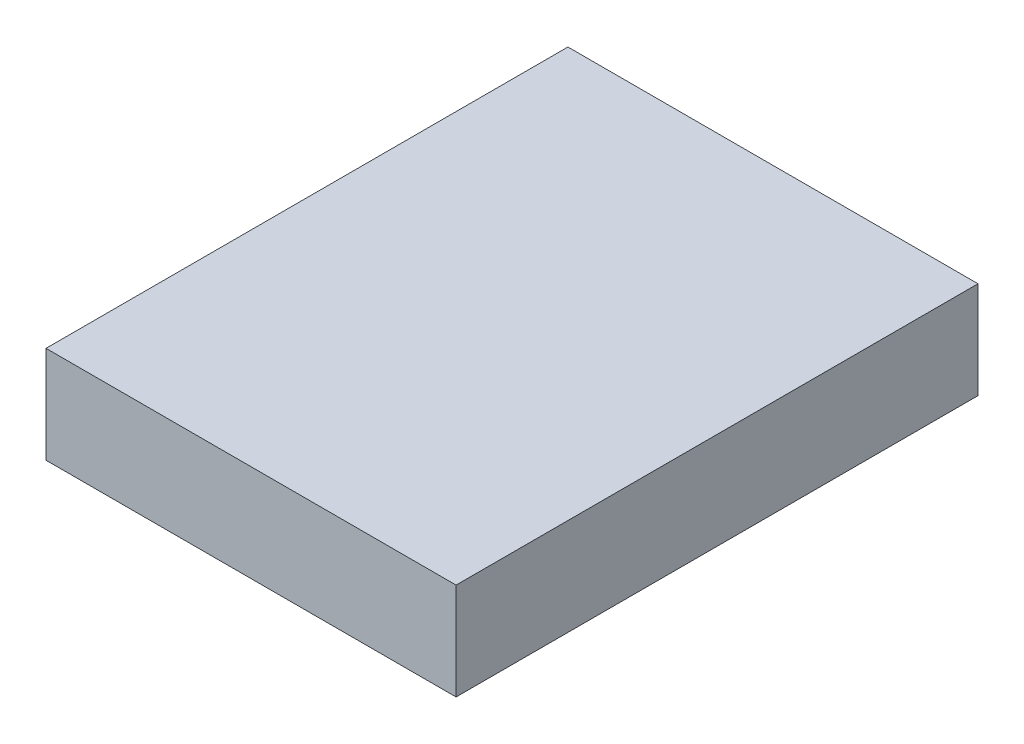
ISO-10303-21;
HEADER;
FILE_DESCRIPTION(('STEP AP214'),'2;1');
FILE_NAME('part.step','',(''),(''),'','','');
FILE_SCHEMA(('AUTOMOTIVE_DESIGN { 1 0 10303 214 1 1 1 1 }'));
ENDSEC;
DATA;
#1=APPLICATION_CONTEXT('core data for automotive mechanical design processes');
#2=APPLICATION_PROTOCOL_DEFINITION('international standard','automotive_design',2000,#1);
#3=PRODUCT_CONTEXT('',#1,'mechanical');
#4=PRODUCT('Part','Part','',(#3));
#5=PRODUCT_RELATED_PRODUCT_CATEGORY('part','',(#4));
#6=PRODUCT_DEFINITION_FORMATION('','',#4);
#7=PRODUCT_DEFINITION_CONTEXT('part definition',#1,'design');
#8=PRODUCT_DEFINITION('design','',#6,#7);
#9=PRODUCT_DEFINITION_SHAPE('','',#8);
#10=(LENGTH_UNIT() NAMED_UNIT(*) SI_UNIT(.MILLI.,.METRE.));
#11=(NAMED_UNIT(*) PLANE_ANGLE_UNIT() SI_UNIT($,.RADIAN.));
#12=(NAMED_UNIT(*) SI_UNIT($,.STERADIAN.) SOLID_ANGLE_UNIT());
#13=UNCERTAINTY_MEASURE_WITH_UNIT(LENGTH_MEASURE(1.E-05),#10,'distance_accuracy_value','');
#14=(GEOMETRIC_REPRESENTATION_CONTEXT(3) GLOBAL_UNCERTAINTY_ASSIGNED_CONTEXT((#13)) GLOBAL_UNIT_ASSIGNED_CONTEXT((#10,
#11,#12)) REPRESENTATION_CONTEXT('',''));
#15=CARTESIAN_POINT('',(0.,0.,0.));
#16=DIRECTION('',(0.,0.,1.));
#17=DIRECTION('',(1.,0.,0.));
#18=AXIS2_PLACEMENT_3D('',#15,#16,#17);
#19=CARTESIAN_POINT('',(29.9874878540281,13.,-33.9718393870808));
#20=DIRECTION('',(-1.,0.,0.));
#21=DIRECTION('',(0.,0.,1.));
#22=AXIS2_PLACEMENT_3D('',#19,#20,#21);
#23=PLANE('',#22);
#24=DIRECTION('',(0.,0.,-1.));
#25=VECTOR('',#24,1.);
#26=CARTESIAN_POINT('',(29.9874878540281,0.,-33.9718393870808));
#27=LINE('',#26,#25);
#28=CARTESIAN_POINT('',(29.9874878540281,0.,36.0281606129192));
#29=VERTEX_POINT('',#28);
#30=CARTESIAN_POINT('',(29.9874878540281,0.,-33.9718393870808));
#31=VERTEX_POINT('',#30);
#32=EDGE_CURVE('E104',#29,#31,#27,.T.);
#33=ORIENTED_EDGE('',*,*,#32,.T.);
#34=DIRECTION('',(0.,-1.,0.));
#35=VECTOR('',#34,1.);
#36=CARTESIAN_POINT('',(29.9874878540281,13.,-33.9718393870808));
#37=LINE('',#36,#35);
#38=CARTESIAN_POINT('',(29.9874878540281,13.,-33.9718393870808));
#39=VERTEX_POINT('',#38);
#40=EDGE_CURVE('E11',#39,#31,#37,.T.);
#41=ORIENTED_EDGE('',*,*,#40,.F.);
#42=DIRECTION('',(0.,0.,-1.));
#43=VECTOR('',#42,1.);
#44=CARTESIAN_POINT('',(29.9874878540281,13.,-33.9718393870808));
#45=LINE('',#44,#43);
#46=CARTESIAN_POINT('',(29.9874878540281,13.,36.0281606129192));
#47=VERTEX_POINT('',#46);
#48=EDGE_CURVE('E92',#47,#39,#45,.T.);
#49=ORIENTED_EDGE('',*,*,#48,.F.);
#50=DIRECTION('',(0.,-1.,0.));
#51=VECTOR('',#50,1.);
#52=CARTESIAN_POINT('',(29.9874878540281,13.,36.0281606129192));
#53=LINE('',#52,#51);
#54=EDGE_CURVE('E100',#47,#29,#53,.T.);
#55=ORIENTED_EDGE('',*,*,#54,.T.);
#56=EDGE_LOOP('',(#33,#41,#49,#55));
#57=FACE_BOUND('',#56,.T.);
#58=ADVANCED_FACE('F41',(#57),#23,.F.);
#59=CARTESIAN_POINT('',(29.9874878540281,13.,-33.9718393870808));
#60=DIRECTION('',(0.,0.,1.));
#61=DIRECTION('',(1.,0.,0.));
#62=AXIS2_PLACEMENT_3D('',#59,#60,#61);
#63=PLANE('',#62);
#64=DIRECTION('',(-1.,0.,0.));
#65=VECTOR('',#64,1.);
#66=CARTESIAN_POINT('',(29.9874878540281,0.,-33.9718393870808));
#67=LINE('',#66,#65);
#68=CARTESIAN_POINT('',(-25.0125121459719,0.,-33.9718393870808));
#69=VERTEX_POINT('',#68);
#70=EDGE_CURVE('E96',#31,#69,#67,.T.);
#71=ORIENTED_EDGE('',*,*,#70,.T.);
#72=DIRECTION('',(0.,-1.,0.));
#73=VECTOR('',#72,1.);
#74=CARTESIAN_POINT('',(-25.0125121459719,13.,-33.9718393870808));
#75=LINE('',#74,#73);
#76=CARTESIAN_POINT('',(-25.0125121459719,13.,-33.9718393870808));
#77=VERTEX_POINT('',#76);
#78=EDGE_CURVE('E49',#77,#69,#75,.T.);
#79=ORIENTED_EDGE('',*,*,#78,.F.);
#80=DIRECTION('',(-1.,0.,0.));
#81=VECTOR('',#80,1.);
#82=CARTESIAN_POINT('',(29.9874878540281,13.,-33.9718393870808));
#83=LINE('',#82,#81);
#84=EDGE_CURVE('E87',#39,#77,#83,.T.);
#85=ORIENTED_EDGE('',*,*,#84,.F.);
#86=ORIENTED_EDGE('',*,*,#40,.T.);
#87=EDGE_LOOP('',(#71,#79,#85,#86));
#88=FACE_BOUND('',#87,.T.);
#89=ADVANCED_FACE('F95',(#88),#63,.F.);
#90=CARTESIAN_POINT('',(-25.0125121459719,13.,-33.9718393870808));
#91=DIRECTION('',(1.,0.,0.));
#92=DIRECTION('',(0.,0.,-1.));
#93=AXIS2_PLACEMENT_3D('',#90,#91,#92);
#94=PLANE('',#93);
#95=DIRECTION('',(0.,0.,1.));
#96=VECTOR('',#95,1.);
#97=CARTESIAN_POINT('',(-25.0125121459719,0.,-33.9718393870808));
#98=LINE('',#97,#96);
#99=CARTESIAN_POINT('',(-25.0125121459719,0.,36.0281606129192));
#100=VERTEX_POINT('',#99);
#101=EDGE_CURVE('E74',#69,#100,#98,.T.);
#102=ORIENTED_EDGE('',*,*,#101,.T.);
#103=DIRECTION('',(0.,-1.,0.));
#104=VECTOR('',#103,1.);
#105=CARTESIAN_POINT('',(-25.0125121459719,13.,36.0281606129192));
#106=LINE('',#105,#104);
#107=CARTESIAN_POINT('',(-25.0125121459719,13.,36.0281606129192));
#108=VERTEX_POINT('',#107);
#109=EDGE_CURVE('E97',#108,#100,#106,.T.);
#110=ORIENTED_EDGE('',*,*,#109,.F.);
#111=DIRECTION('',(0.,0.,1.));
#112=VECTOR('',#111,1.);
#113=CARTESIAN_POINT('',(-25.0125121459719,13.,-33.9718393870808));
#114=LINE('',#113,#112);
#115=EDGE_CURVE('E90',#77,#108,#114,.T.);
#116=ORIENTED_EDGE('',*,*,#115,.F.);
#117=ORIENTED_EDGE('',*,*,#78,.T.);
#118=EDGE_LOOP('',(#102,#110,#116,#117));
#119=FACE_BOUND('',#118,.T.);
#120=ADVANCED_FACE('F98',(#119),#94,.F.);
#121=CARTESIAN_POINT('',(29.9874878540281,13.,36.0281606129192));
#122=DIRECTION('',(0.,0.,-1.));
#123=DIRECTION('',(-1.,0.,0.));
#124=AXIS2_PLACEMENT_3D('',#121,#122,#123);
#125=PLANE('',#124);
#126=DIRECTION('',(1.,0.,0.));
#127=VECTOR('',#126,1.);
#128=CARTESIAN_POINT('',(29.9874878540281,0.,36.0281606129192));
#129=LINE('',#128,#127);
#130=EDGE_CURVE('E80',#100,#29,#129,.T.);
#131=ORIENTED_EDGE('',*,*,#130,.T.);
#132=ORIENTED_EDGE('',*,*,#54,.F.);
#133=DIRECTION('',(1.,0.,0.));
#134=VECTOR('',#133,1.);
#135=CARTESIAN_POINT('',(29.9874878540281,13.,36.0281606129192));
#136=LINE('',#135,#134);
#137=EDGE_CURVE('E57',#108,#47,#136,.T.);
#138=ORIENTED_EDGE('',*,*,#137,.F.);
#139=ORIENTED_EDGE('',*,*,#109,.T.);
#140=EDGE_LOOP('',(#131,#132,#138,#139));
#141=FACE_BOUND('',#140,.T.);
#142=ADVANCED_FACE('F111',(#141),#125,.F.);
#143=CARTESIAN_POINT('',(0.,13.,0.));
#144=DIRECTION('',(0.,-1.,0.));
#145=DIRECTION('',(0.,0.,-1.));
#146=AXIS2_PLACEMENT_3D('',#143,#144,#145);
#147=PLANE('',#146);
#148=ORIENTED_EDGE('',*,*,#48,.T.);
#149=ORIENTED_EDGE('',*,*,#84,.T.);
#150=ORIENTED_EDGE('',*,*,#115,.T.);
#151=ORIENTED_EDGE('',*,*,#137,.T.);
#152=EDGE_LOOP('',(#148,#149,#150,#151));
#153=FACE_BOUND('',#152,.T.);
#154=ADVANCED_FACE('F88',(#153),#147,.F.);
#155=CARTESIAN_POINT('',(0.,0.,0.));
#156=DIRECTION('',(0.,-1.,0.));
#157=DIRECTION('',(0.,0.,-1.));
#158=AXIS2_PLACEMENT_3D('',#155,#156,#157);
#159=PLANE('',#158);
#160=ORIENTED_EDGE('',*,*,#32,.F.);
#161=ORIENTED_EDGE('',*,*,#130,.F.);
#162=ORIENTED_EDGE('',*,*,#101,.F.);
#163=ORIENTED_EDGE('',*,*,#70,.F.);
#164=EDGE_LOOP('',(#160,#161,#162,#163));
#165=FACE_BOUND('',#164,.T.);
#166=ADVANCED_FACE('F114',(#165),#159,.T.);
#167=CLOSED_SHELL('',(#58,#89,#120,#142,#154,#166));
#168=MANIFOLD_SOLID_BREP('B2',#167);
#169=ADVANCED_BREP_SHAPE_REPRESENTATION('',(#18,#168),#14);
#170=SHAPE_DEFINITION_REPRESENTATION(#9,#169);
ENDSEC;
END-ISO-10303-21;
